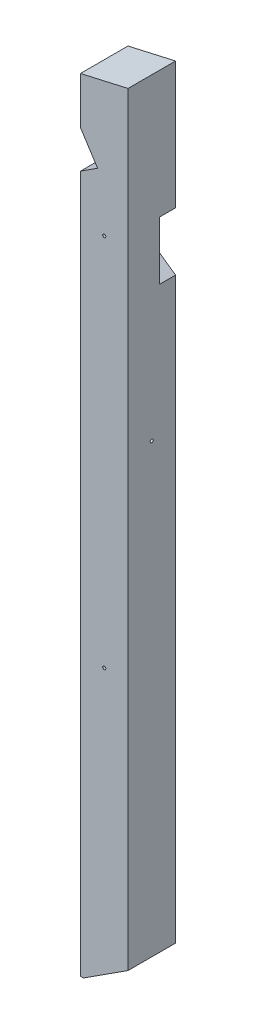
ISO-10303-21;
HEADER;
FILE_DESCRIPTION(('STEP AP214'),'2;1');
FILE_NAME('part.step','',(''),(''),'','','');
FILE_SCHEMA(('AUTOMOTIVE_DESIGN { 1 0 10303 214 1 1 1 1 }'));
ENDSEC;
DATA;
#1=APPLICATION_CONTEXT('core data for automotive mechanical design processes');
#2=APPLICATION_PROTOCOL_DEFINITION('international standard','automotive_design',2000,#1);
#3=PRODUCT_CONTEXT('',#1,'mechanical');
#4=PRODUCT('Part','Part','',(#3));
#5=PRODUCT_RELATED_PRODUCT_CATEGORY('part','',(#4));
#6=PRODUCT_DEFINITION_FORMATION('','',#4);
#7=PRODUCT_DEFINITION_CONTEXT('part definition',#1,'design');
#8=PRODUCT_DEFINITION('design','',#6,#7);
#9=PRODUCT_DEFINITION_SHAPE('','',#8);
#10=(LENGTH_UNIT() NAMED_UNIT(*) SI_UNIT(.MILLI.,.METRE.));
#11=(NAMED_UNIT(*) PLANE_ANGLE_UNIT() SI_UNIT($,.RADIAN.));
#12=(NAMED_UNIT(*) SI_UNIT($,.STERADIAN.) SOLID_ANGLE_UNIT());
#13=UNCERTAINTY_MEASURE_WITH_UNIT(LENGTH_MEASURE(1.E-05),#10,'distance_accuracy_value','');
#14=(GEOMETRIC_REPRESENTATION_CONTEXT(3) GLOBAL_UNCERTAINTY_ASSIGNED_CONTEXT((#13)) GLOBAL_UNIT_ASSIGNED_CONTEXT((#10,
#11,#12)) REPRESENTATION_CONTEXT('',''));
#15=CARTESIAN_POINT('',(0.,0.,0.));
#16=DIRECTION('',(0.,0.,1.));
#17=DIRECTION('',(1.,0.,0.));
#18=AXIS2_PLACEMENT_3D('',#15,#16,#17);
#19=CARTESIAN_POINT('',(-75.,1250.,-75.));
#20=DIRECTION('',(0.,0.,1.));
#21=DIRECTION('',(1.,0.,0.));
#22=AXIS2_PLACEMENT_3D('',#19,#20,#21);
#23=PLANE('',#22);
#24=DIRECTION('',(0.,-1.,0.));
#25=VECTOR('',#24,1.);
#26=CARTESIAN_POINT('',(75.,1250.,-75.));
#27=LINE('',#26,#25);
#28=CARTESIAN_POINT('',(75.,1250.,-75.));
#29=VERTEX_POINT('',#28);
#30=CARTESIAN_POINT('',(75.,848.874160527311,-75.));
#31=VERTEX_POINT('',#30);
#32=EDGE_CURVE('E224',#29,#31,#27,.T.);
#33=ORIENTED_EDGE('',*,*,#32,.T.);
#34=DIRECTION('',(0.81711888506879,-0.576469190559164,0.));
#35=VECTOR('',#34,1.);
#36=CARTESIAN_POINT('',(-75.0000000000008,954.697658385393,-75.));
#37=LINE('',#36,#35);
#38=CARTESIAN_POINT('',(-70.9333689934702,951.828690934665,-75.));
#39=VERTEX_POINT('',#38);
#40=EDGE_CURVE('E141',#39,#31,#37,.T.);
#41=ORIENTED_EDGE('',*,*,#40,.F.);
#42=DIRECTION('',(0.840689622138082,0.541517275097784,0.));
#43=VECTOR('',#42,1.);
#44=CARTESIAN_POINT('',(-20.8482724902223,984.090234633123,-75.));
#45=LINE('',#44,#43);
#46=CARTESIAN_POINT('',(-20.8482724902223,984.090234633123,-75.));
#47=VERTEX_POINT('',#46);
#48=EDGE_CURVE('E178',#39,#47,#45,.T.);
#49=ORIENTED_EDGE('',*,*,#48,.T.);
#50=DIRECTION('',(-0.541517275097784,0.840689622138082,0.));
#51=VECTOR('',#50,1.);
#52=CARTESIAN_POINT('',(-75.,1068.15919684693,-75.));
#53=LINE('',#52,#51);
#54=CARTESIAN_POINT('',(-75.,1068.15919684693,-75.));
#55=VERTEX_POINT('',#54);
#56=EDGE_CURVE('E180',#47,#55,#53,.T.);
#57=ORIENTED_EDGE('',*,*,#56,.T.);
#58=DIRECTION('',(0.,-1.,0.));
#59=VECTOR('',#58,1.);
#60=CARTESIAN_POINT('',(-75.,1250.,-75.));
#61=LINE('',#60,#59);
#62=CARTESIAN_POINT('',(-75.,1215.95666298101,-75.));
#63=VERTEX_POINT('',#62);
#64=EDGE_CURVE('E222',#63,#55,#61,.T.);
#65=ORIENTED_EDGE('',*,*,#64,.F.);
#66=DIRECTION('',(0.97519965033672,0.221327002381408,0.));
#67=VECTOR('',#66,1.);
#68=CARTESIAN_POINT('',(75.,1250.,-75.));
#69=LINE('',#68,#67);
#70=EDGE_CURVE('E171',#63,#29,#69,.T.);
#71=ORIENTED_EDGE('',*,*,#70,.T.);
#72=EDGE_LOOP('',(#33,#41,#49,#57,#65,#71));
#73=FACE_BOUND('',#72,.T.);
#74=ADVANCED_FACE('F37',(#73),#23,.F.);
#75=CARTESIAN_POINT('',(0.,810.,-75.));
#76=DIRECTION('',(0.,0.,1.));
#77=DIRECTION('',(1.,0.,0.));
#78=AXIS2_PLACEMENT_3D('',#75,#76,#77);
#79=CYLINDRICAL_SURFACE('',#78,5.00000000000001);
#80=CARTESIAN_POINT('',(0.,810.,75.));
#81=DIRECTION('',(0.,0.,1.));
#82=DIRECTION('',(1.,0.,0.));
#83=AXIS2_PLACEMENT_3D('',#80,#81,#82);
#84=CIRCLE('',#83,5.00000000000001);
#85=CARTESIAN_POINT('',(5.00000000000001,810.,75.));
#86=VERTEX_POINT('',#85);
#87=EDGE_CURVE('E196',#86,#86,#84,.T.);
#88=ORIENTED_EDGE('',*,*,#87,.T.);
#89=EDGE_LOOP('',(#88));
#90=FACE_BOUND('',#89,.T.);
#91=CARTESIAN_POINT('',(0.,810.,-25.));
#92=DIRECTION('',(0.,0.,-1.));
#93=DIRECTION('',(-1.,0.,0.));
#94=AXIS2_PLACEMENT_3D('',#91,#92,#93);
#95=CIRCLE('',#94,5.00000000000001);
#96=CARTESIAN_POINT('',(-5.00000000000001,810.,-25.));
#97=VERTEX_POINT('',#96);
#98=EDGE_CURVE('E153',#97,#97,#95,.F.);
#99=ORIENTED_EDGE('',*,*,#98,.F.);
#100=EDGE_LOOP('',(#99));
#101=FACE_BOUND('',#100,.T.);
#102=ADVANCED_FACE('F283',(#90,#101),#79,.F.);
#103=CARTESIAN_POINT('',(-75.,1250.,-75.));
#104=DIRECTION('',(1.,0.,0.));
#105=DIRECTION('',(0.,0.,-1.));
#106=AXIS2_PLACEMENT_3D('',#103,#104,#105);
#107=PLANE('',#106);
#108=DIRECTION('',(0.,-1.,0.));
#109=VECTOR('',#108,1.);
#110=CARTESIAN_POINT('',(-75.,1250.,75.));
#111=LINE('',#110,#109);
#112=CARTESIAN_POINT('',(-75.,1215.95666298101,75.));
#113=VERTEX_POINT('',#112);
#114=CARTESIAN_POINT('',(-75.,1068.15919684693,75.));
#115=VERTEX_POINT('',#114);
#116=EDGE_CURVE('E219',#113,#115,#111,.T.);
#117=ORIENTED_EDGE('',*,*,#116,.F.);
#118=DIRECTION('',(0.,0.,1.));
#119=VECTOR('',#118,1.);
#120=CARTESIAN_POINT('',(-75.,1215.95666298101,-75.));
#121=LINE('',#120,#119);
#122=EDGE_CURVE('E174',#63,#113,#121,.T.);
#123=ORIENTED_EDGE('',*,*,#122,.F.);
#124=ORIENTED_EDGE('',*,*,#64,.T.);
#125=DIRECTION('',(0.,0.,1.));
#126=VECTOR('',#125,1.);
#127=CARTESIAN_POINT('',(-75.,1068.15919684693,-75.));
#128=LINE('',#127,#126);
#129=EDGE_CURVE('E189',#55,#115,#128,.T.);
#130=ORIENTED_EDGE('',*,*,#129,.T.);
#131=EDGE_LOOP('',(#117,#123,#124,#130));
#132=FACE_BOUND('',#131,.T.);
#133=ADVANCED_FACE('F265',(#132),#107,.F.);
#134=CARTESIAN_POINT('',(75.,1250.,-75.));
#135=DIRECTION('',(-1.,0.,0.));
#136=DIRECTION('',(0.,0.,1.));
#137=AXIS2_PLACEMENT_3D('',#134,#135,#136);
#138=PLANE('',#137);
#139=CARTESIAN_POINT('',(75.,250.,0.));
#140=DIRECTION('',(-1.,0.,0.));
#141=DIRECTION('',(0.,0.,1.));
#142=AXIS2_PLACEMENT_3D('',#139,#140,#141);
#143=CIRCLE('',#142,5.00000000000001);
#144=CARTESIAN_POINT('',(75.,250.,5.));
#145=VERTEX_POINT('',#144);
#146=EDGE_CURVE('E157',#145,#145,#143,.T.);
#147=ORIENTED_EDGE('',*,*,#146,.T.);
#148=EDGE_LOOP('',(#147));
#149=FACE_BOUND('',#148,.T.);
#150=DIRECTION('',(0.,-1.,0.));
#151=VECTOR('',#150,1.);
#152=CARTESIAN_POINT('',(75.,848.874160527311,-25.));
#153=LINE('',#152,#151);
#154=CARTESIAN_POINT('',(75.,848.874160527311,-25.));
#155=VERTEX_POINT('',#154);
#156=CARTESIAN_POINT('',(75.,665.302341614606,-25.));
#157=VERTEX_POINT('',#156);
#158=EDGE_CURVE('E132',#155,#157,#153,.T.);
#159=ORIENTED_EDGE('',*,*,#158,.F.);
#160=DIRECTION('',(0.,0.,-1.));
#161=VECTOR('',#160,1.);
#162=CARTESIAN_POINT('',(75.,848.874160527311,-25.));
#163=LINE('',#162,#161);
#164=EDGE_CURVE('E146',#155,#31,#163,.T.);
#165=ORIENTED_EDGE('',*,*,#164,.T.);
#166=ORIENTED_EDGE('',*,*,#32,.F.);
#167=DIRECTION('',(0.,0.,-1.));
#168=VECTOR('',#167,1.);
#169=CARTESIAN_POINT('',(75.,1250.,-75.));
#170=LINE('',#169,#168);
#171=CARTESIAN_POINT('',(75.,1250.,75.));
#172=VERTEX_POINT('',#171);
#173=EDGE_CURVE('E205',#172,#29,#170,.T.);
#174=ORIENTED_EDGE('',*,*,#173,.F.);
#175=DIRECTION('',(0.,-1.,0.));
#176=VECTOR('',#175,1.);
#177=CARTESIAN_POINT('',(75.,1250.,75.));
#178=LINE('',#177,#176);
#179=CARTESIAN_POINT('',(75.,-1159.47022319023,75.));
#180=VERTEX_POINT('',#179);
#181=EDGE_CURVE('E207',#172,#180,#178,.T.);
#182=ORIENTED_EDGE('',*,*,#181,.T.);
#183=DIRECTION('',(0.,0.,1.));
#184=VECTOR('',#183,1.);
#185=CARTESIAN_POINT('',(75.,-1159.47022319023,-75.));
#186=LINE('',#185,#184);
#187=CARTESIAN_POINT('',(75.,-1159.47022319023,-75.));
#188=VERTEX_POINT('',#187);
#189=EDGE_CURVE('E165',#188,#180,#186,.T.);
#190=ORIENTED_EDGE('',*,*,#189,.F.);
#191=CARTESIAN_POINT('',(75.,665.302341614606,-75.));
#192=VERTEX_POINT('',#191);
#193=EDGE_CURVE('E145',#192,#188,#27,.T.);
#194=ORIENTED_EDGE('',*,*,#193,.F.);
#195=DIRECTION('',(0.,0.,-1.));
#196=VECTOR('',#195,1.);
#197=CARTESIAN_POINT('',(75.,665.302341614606,-25.));
#198=LINE('',#197,#196);
#199=EDGE_CURVE('E129',#157,#192,#198,.T.);
#200=ORIENTED_EDGE('',*,*,#199,.F.);
#201=EDGE_LOOP('',(#159,#165,#166,#174,#182,#190,#194,#200));
#202=FACE_BOUND('',#201,.T.);
#203=ADVANCED_FACE('F39',(#149,#202),#138,.F.);
#204=CARTESIAN_POINT('',(0.,-370.,-75.));
#205=DIRECTION('',(0.,0.,1.));
#206=DIRECTION('',(1.,0.,0.));
#207=AXIS2_PLACEMENT_3D('',#204,#205,#206);
#208=CIRCLE('',#207,5.00000000000001);
#209=CARTESIAN_POINT('',(5.00000000000001,-370.,-75.));
#210=VERTEX_POINT('',#209);
#211=EDGE_CURVE('E192',#210,#210,#208,.T.);
#212=ORIENTED_EDGE('',*,*,#211,.T.);
#213=EDGE_LOOP('',(#212));
#214=FACE_BOUND('',#213,.T.);
#215=CARTESIAN_POINT('',(-75.,771.125839472687,-75.));
#216=VERTEX_POINT('',#215);
#217=CARTESIAN_POINT('',(-75.,-1250.,-75.));
#218=VERTEX_POINT('',#217);
#219=EDGE_CURVE('E221',#216,#218,#61,.T.);
#220=ORIENTED_EDGE('',*,*,#219,.F.);
#221=DIRECTION('',(-0.81711888506879,0.576469190559164,0.));
#222=VECTOR('',#221,1.);
#223=CARTESIAN_POINT('',(75.,665.302341614606,-75.));
#224=LINE('',#223,#222);
#225=EDGE_CURVE('E239',#192,#216,#224,.T.);
#226=ORIENTED_EDGE('',*,*,#225,.F.);
#227=ORIENTED_EDGE('',*,*,#193,.T.);
#228=DIRECTION('',(-0.840689622138083,-0.541517275097783,0.));
#229=VECTOR('',#228,1.);
#230=CARTESIAN_POINT('',(75.,-1159.47022319023,-75.));
#231=LINE('',#230,#229);
#232=CARTESIAN_POINT('',(-65.5448124341153,-1250.,-75.));
#233=VERTEX_POINT('',#232);
#234=EDGE_CURVE('E162',#188,#233,#231,.T.);
#235=ORIENTED_EDGE('',*,*,#234,.T.);
#236=DIRECTION('',(-1.,0.,0.));
#237=VECTOR('',#236,1.);
#238=CARTESIAN_POINT('',(-75.,-1250.,-75.));
#239=LINE('',#238,#237);
#240=EDGE_CURVE('E199',#233,#218,#239,.T.);
#241=ORIENTED_EDGE('',*,*,#240,.T.);
#242=EDGE_LOOP('',(#220,#226,#227,#235,#241));
#243=FACE_BOUND('',#242,.T.);
#244=ADVANCED_FACE('F245',(#214,#243),#23,.F.);
#245=CARTESIAN_POINT('',(-75.,250.,0.));
#246=DIRECTION('',(-1.,0.,0.));
#247=DIRECTION('',(0.,0.,1.));
#248=AXIS2_PLACEMENT_3D('',#245,#246,#247);
#249=CIRCLE('',#248,5.00000000000001);
#250=CARTESIAN_POINT('',(-75.,250.,5.00000000000002));
#251=VERTEX_POINT('',#250);
#252=EDGE_CURVE('E156',#251,#251,#249,.T.);
#253=ORIENTED_EDGE('',*,*,#252,.F.);
#254=EDGE_LOOP('',(#253));
#255=FACE_BOUND('',#254,.T.);
#256=DIRECTION('',(0.,1.,0.));
#257=VECTOR('',#256,1.);
#258=CARTESIAN_POINT('',(-75.,1250.,-25.));
#259=LINE('',#258,#257);
#260=CARTESIAN_POINT('',(-75.,771.125839472687,-25.));
#261=VERTEX_POINT('',#260);
#262=CARTESIAN_POINT('',(-75.,949.209233190101,-25.));
#263=VERTEX_POINT('',#262);
#264=EDGE_CURVE('E52',#261,#263,#259,.T.);
#265=ORIENTED_EDGE('',*,*,#264,.F.);
#266=DIRECTION('',(0.,0.,-1.));
#267=VECTOR('',#266,1.);
#268=CARTESIAN_POINT('',(-75.,771.125839472687,-75.));
#269=LINE('',#268,#267);
#270=EDGE_CURVE('E11',#261,#216,#269,.T.);
#271=ORIENTED_EDGE('',*,*,#270,.T.);
#272=ORIENTED_EDGE('',*,*,#219,.T.);
#273=DIRECTION('',(0.,0.,1.));
#274=VECTOR('',#273,1.);
#275=CARTESIAN_POINT('',(-75.,-1250.,-75.));
#276=LINE('',#275,#274);
#277=CARTESIAN_POINT('',(-75.,-1250.,75.));
#278=VERTEX_POINT('',#277);
#279=EDGE_CURVE('E211',#218,#278,#276,.T.);
#280=ORIENTED_EDGE('',*,*,#279,.T.);
#281=CARTESIAN_POINT('',(-75.,949.209233190101,75.));
#282=VERTEX_POINT('',#281);
#283=EDGE_CURVE('E218',#282,#278,#111,.T.);
#284=ORIENTED_EDGE('',*,*,#283,.F.);
#285=DIRECTION('',(0.,0.,1.));
#286=VECTOR('',#285,1.);
#287=CARTESIAN_POINT('',(-75.,949.209233190101,-75.));
#288=LINE('',#287,#286);
#289=EDGE_CURVE('E184',#263,#282,#288,.T.);
#290=ORIENTED_EDGE('',*,*,#289,.F.);
#291=EDGE_LOOP('',(#265,#271,#272,#280,#284,#290));
#292=FACE_BOUND('',#291,.T.);
#293=ADVANCED_FACE('F244',(#255,#292),#107,.F.);
#294=CARTESIAN_POINT('',(-75.,1250.,75.));
#295=DIRECTION('',(0.,0.,-1.));
#296=DIRECTION('',(-1.,0.,0.));
#297=AXIS2_PLACEMENT_3D('',#294,#295,#296);
#298=PLANE('',#297);
#299=ORIENTED_EDGE('',*,*,#87,.F.);
#300=EDGE_LOOP('',(#299));
#301=FACE_BOUND('',#300,.T.);
#302=CARTESIAN_POINT('',(0.,-370.,75.));
#303=DIRECTION('',(0.,0.,1.));
#304=DIRECTION('',(1.,0.,0.));
#305=AXIS2_PLACEMENT_3D('',#302,#303,#304);
#306=CIRCLE('',#305,5.00000000000001);
#307=CARTESIAN_POINT('',(5.00000000000001,-370.,75.));
#308=VERTEX_POINT('',#307);
#309=EDGE_CURVE('E200',#308,#308,#306,.T.);
#310=ORIENTED_EDGE('',*,*,#309,.F.);
#311=EDGE_LOOP('',(#310));
#312=FACE_BOUND('',#311,.T.);
#313=DIRECTION('',(1.,0.,0.));
#314=VECTOR('',#313,1.);
#315=CARTESIAN_POINT('',(-75.,-1250.,75.));
#316=LINE('',#315,#314);
#317=CARTESIAN_POINT('',(-65.5448124341153,-1250.,75.));
#318=VERTEX_POINT('',#317);
#319=EDGE_CURVE('E208',#278,#318,#316,.T.);
#320=ORIENTED_EDGE('',*,*,#319,.T.);
#321=DIRECTION('',(-0.840689622138083,-0.541517275097783,0.));
#322=VECTOR('',#321,1.);
#323=CARTESIAN_POINT('',(75.,-1159.47022319023,75.));
#324=LINE('',#323,#322);
#325=EDGE_CURVE('E60',#180,#318,#324,.T.);
#326=ORIENTED_EDGE('',*,*,#325,.F.);
#327=ORIENTED_EDGE('',*,*,#181,.F.);
#328=DIRECTION('',(0.97519965033672,0.221327002381408,0.));
#329=VECTOR('',#328,1.);
#330=CARTESIAN_POINT('',(75.,1250.,75.));
#331=LINE('',#330,#329);
#332=EDGE_CURVE('E169',#113,#172,#331,.T.);
#333=ORIENTED_EDGE('',*,*,#332,.F.);
#334=ORIENTED_EDGE('',*,*,#116,.T.);
#335=DIRECTION('',(-0.541517275097784,0.840689622138082,0.));
#336=VECTOR('',#335,1.);
#337=CARTESIAN_POINT('',(-75.,1068.15919684693,75.));
#338=LINE('',#337,#336);
#339=CARTESIAN_POINT('',(-20.8482724902223,984.090234633123,75.));
#340=VERTEX_POINT('',#339);
#341=EDGE_CURVE('E181',#340,#115,#338,.T.);
#342=ORIENTED_EDGE('',*,*,#341,.F.);
#343=DIRECTION('',(0.840689622138082,0.541517275097784,0.));
#344=VECTOR('',#343,1.);
#345=CARTESIAN_POINT('',(-20.8482724902223,984.090234633123,75.));
#346=LINE('',#345,#344);
#347=EDGE_CURVE('E177',#282,#340,#346,.T.);
#348=ORIENTED_EDGE('',*,*,#347,.F.);
#349=ORIENTED_EDGE('',*,*,#283,.T.);
#350=EDGE_LOOP('',(#320,#326,#327,#333,#334,#342,#348,#349));
#351=FACE_BOUND('',#350,.T.);
#352=ADVANCED_FACE('F255',(#301,#312,#351),#298,.F.);
#353=CARTESIAN_POINT('',(0.,-1250.,0.));
#354=DIRECTION('',(0.,1.,0.));
#355=DIRECTION('',(0.,0.,1.));
#356=AXIS2_PLACEMENT_3D('',#353,#354,#355);
#357=PLANE('',#356);
#358=ORIENTED_EDGE('',*,*,#240,.F.);
#359=DIRECTION('',(0.,0.,1.));
#360=VECTOR('',#359,1.);
#361=CARTESIAN_POINT('',(-65.5448124341153,-1250.,-75.));
#362=LINE('',#361,#360);
#363=EDGE_CURVE('E167',#233,#318,#362,.T.);
#364=ORIENTED_EDGE('',*,*,#363,.T.);
#365=ORIENTED_EDGE('',*,*,#319,.F.);
#366=ORIENTED_EDGE('',*,*,#279,.F.);
#367=EDGE_LOOP('',(#358,#364,#365,#366));
#368=FACE_BOUND('',#367,.T.);
#369=ADVANCED_FACE('F251',(#368),#357,.F.);
#370=CARTESIAN_POINT('',(0.,-370.,-75.));
#371=DIRECTION('',(0.,0.,1.));
#372=DIRECTION('',(1.,0.,0.));
#373=AXIS2_PLACEMENT_3D('',#370,#371,#372);
#374=CYLINDRICAL_SURFACE('',#373,5.00000000000001);
#375=ORIENTED_EDGE('',*,*,#211,.F.);
#376=EDGE_LOOP('',(#375));
#377=FACE_BOUND('',#376,.T.);
#378=ORIENTED_EDGE('',*,*,#309,.T.);
#379=EDGE_LOOP('',(#378));
#380=FACE_BOUND('',#379,.T.);
#381=ADVANCED_FACE('F301',(#377,#380),#374,.F.);
#382=CARTESIAN_POINT('',(-75.,1068.15919684693,-75.));
#383=DIRECTION('',(0.840689622138082,0.541517275097784,0.));
#384=DIRECTION('',(-0.541517275097784,0.840689622138082,0.));
#385=AXIS2_PLACEMENT_3D('',#382,#383,#384);
#386=PLANE('',#385);
#387=ORIENTED_EDGE('',*,*,#341,.T.);
#388=ORIENTED_EDGE('',*,*,#129,.F.);
#389=ORIENTED_EDGE('',*,*,#56,.F.);
#390=DIRECTION('',(0.,0.,1.));
#391=VECTOR('',#390,1.);
#392=CARTESIAN_POINT('',(-20.8482724902223,984.090234633123,-75.));
#393=LINE('',#392,#391);
#394=EDGE_CURVE('E193',#47,#340,#393,.T.);
#395=ORIENTED_EDGE('',*,*,#394,.T.);
#396=EDGE_LOOP('',(#387,#388,#389,#395));
#397=FACE_BOUND('',#396,.T.);
#398=ADVANCED_FACE('F260',(#397),#386,.F.);
#399=CARTESIAN_POINT('',(-20.8482724902223,984.090234633123,-75.));
#400=DIRECTION('',(0.541517275097784,-0.840689622138082,0.));
#401=DIRECTION('',(0.840689622138082,0.541517275097784,0.));
#402=AXIS2_PLACEMENT_3D('',#399,#400,#401);
#403=PLANE('',#402);
#404=ORIENTED_EDGE('',*,*,#48,.F.);
#405=DIRECTION('',(0.,0.,1.));
#406=VECTOR('',#405,1.);
#407=CARTESIAN_POINT('',(-70.9333689934701,951.828690934665,-75.));
#408=LINE('',#407,#406);
#409=CARTESIAN_POINT('',(-70.9333689934702,951.828690934665,-25.));
#410=VERTEX_POINT('',#409);
#411=EDGE_CURVE('E45',#39,#410,#408,.T.);
#412=ORIENTED_EDGE('',*,*,#411,.T.);
#413=DIRECTION('',(0.840689622138082,0.541517275097784,0.));
#414=VECTOR('',#413,1.);
#415=CARTESIAN_POINT('',(-20.8482724902223,984.090234633123,-25.));
#416=LINE('',#415,#414);
#417=EDGE_CURVE('E227',#263,#410,#416,.T.);
#418=ORIENTED_EDGE('',*,*,#417,.F.);
#419=ORIENTED_EDGE('',*,*,#289,.T.);
#420=ORIENTED_EDGE('',*,*,#347,.T.);
#421=ORIENTED_EDGE('',*,*,#394,.F.);
#422=EDGE_LOOP('',(#404,#412,#418,#419,#420,#421));
#423=FACE_BOUND('',#422,.T.);
#424=ADVANCED_FACE('F231',(#423),#403,.F.);
#425=CARTESIAN_POINT('',(75.,1250.,-75.));
#426=DIRECTION('',(0.221327002381408,-0.97519965033672,0.));
#427=DIRECTION('',(0.97519965033672,0.221327002381408,0.));
#428=AXIS2_PLACEMENT_3D('',#425,#426,#427);
#429=PLANE('',#428);
#430=ORIENTED_EDGE('',*,*,#332,.T.);
#431=ORIENTED_EDGE('',*,*,#173,.T.);
#432=ORIENTED_EDGE('',*,*,#70,.F.);
#433=ORIENTED_EDGE('',*,*,#122,.T.);
#434=EDGE_LOOP('',(#430,#431,#432,#433));
#435=FACE_BOUND('',#434,.T.);
#436=ADVANCED_FACE('F268',(#435),#429,.F.);
#437=CARTESIAN_POINT('',(75.,-1159.47022319023,-75.));
#438=DIRECTION('',(-0.541517275097783,0.840689622138083,0.));
#439=DIRECTION('',(-0.840689622138083,-0.541517275097783,0.));
#440=AXIS2_PLACEMENT_3D('',#437,#438,#439);
#441=PLANE('',#440);
#442=ORIENTED_EDGE('',*,*,#325,.T.);
#443=ORIENTED_EDGE('',*,*,#363,.F.);
#444=ORIENTED_EDGE('',*,*,#234,.F.);
#445=ORIENTED_EDGE('',*,*,#189,.T.);
#446=EDGE_LOOP('',(#442,#443,#444,#445));
#447=FACE_BOUND('',#446,.T.);
#448=ADVANCED_FACE('F271',(#447),#441,.F.);
#449=CARTESIAN_POINT('',(75.,250.,0.));
#450=DIRECTION('',(-1.,0.,0.));
#451=DIRECTION('',(0.,0.,1.));
#452=AXIS2_PLACEMENT_3D('',#449,#450,#451);
#453=CYLINDRICAL_SURFACE('',#452,5.00000000000001);
#454=ORIENTED_EDGE('',*,*,#146,.F.);
#455=EDGE_LOOP('',(#454));
#456=FACE_BOUND('',#455,.T.);
#457=ORIENTED_EDGE('',*,*,#252,.T.);
#458=EDGE_LOOP('',(#457));
#459=FACE_BOUND('',#458,.T.);
#460=ADVANCED_FACE('F273',(#456,#459),#453,.F.);
#461=CARTESIAN_POINT('',(75.,665.302341614606,-25.));
#462=DIRECTION('',(-0.576469190559164,-0.81711888506879,0.));
#463=DIRECTION('',(0.81711888506879,-0.576469190559164,0.));
#464=AXIS2_PLACEMENT_3D('',#461,#462,#463);
#465=PLANE('',#464);
#466=DIRECTION('',(-0.81711888506879,0.576469190559164,0.));
#467=VECTOR('',#466,1.);
#468=CARTESIAN_POINT('',(75.,665.302341614606,-25.));
#469=LINE('',#468,#467);
#470=EDGE_CURVE('E125',#157,#261,#469,.T.);
#471=ORIENTED_EDGE('',*,*,#470,.F.);
#472=ORIENTED_EDGE('',*,*,#199,.T.);
#473=ORIENTED_EDGE('',*,*,#225,.T.);
#474=ORIENTED_EDGE('',*,*,#270,.F.);
#475=EDGE_LOOP('',(#471,#472,#473,#474));
#476=FACE_BOUND('',#475,.T.);
#477=ADVANCED_FACE('F127',(#476),#465,.F.);
#478=CARTESIAN_POINT('',(-75.0000000000008,954.697658385393,-25.));
#479=DIRECTION('',(0.576469190559164,0.81711888506879,0.));
#480=DIRECTION('',(-0.81711888506879,0.576469190559164,0.));
#481=AXIS2_PLACEMENT_3D('',#478,#479,#480);
#482=PLANE('',#481);
#483=ORIENTED_EDGE('',*,*,#40,.T.);
#484=ORIENTED_EDGE('',*,*,#164,.F.);
#485=DIRECTION('',(0.81711888506879,-0.576469190559164,0.));
#486=VECTOR('',#485,1.);
#487=CARTESIAN_POINT('',(-75.0000000000008,954.697658385393,-25.));
#488=LINE('',#487,#486);
#489=EDGE_CURVE('E131',#410,#155,#488,.T.);
#490=ORIENTED_EDGE('',*,*,#489,.F.);
#491=ORIENTED_EDGE('',*,*,#411,.F.);
#492=EDGE_LOOP('',(#483,#484,#490,#491));
#493=FACE_BOUND('',#492,.T.);
#494=ADVANCED_FACE('F236',(#493),#482,.F.);
#495=CARTESIAN_POINT('',(0.,0.,-25.));
#496=DIRECTION('',(0.,0.,-1.));
#497=DIRECTION('',(-1.,0.,0.));
#498=AXIS2_PLACEMENT_3D('',#495,#496,#497);
#499=PLANE('',#498);
#500=ORIENTED_EDGE('',*,*,#264,.T.);
#501=ORIENTED_EDGE('',*,*,#417,.T.);
#502=ORIENTED_EDGE('',*,*,#489,.T.);
#503=ORIENTED_EDGE('',*,*,#158,.T.);
#504=ORIENTED_EDGE('',*,*,#470,.T.);
#505=EDGE_LOOP('',(#500,#501,#502,#503,#504));
#506=FACE_BOUND('',#505,.T.);
#507=ORIENTED_EDGE('',*,*,#98,.T.);
#508=EDGE_LOOP('',(#507));
#509=FACE_BOUND('',#508,.T.);
#510=ADVANCED_FACE('F135',(#506,#509),#499,.T.);
#511=CLOSED_SHELL('',(#74,#102,#133,#203,#244,#293,#352,#369,#381,#398,#424,#436,#448,#460,#477,
#494,#510));
#512=MANIFOLD_SOLID_BREP('B2',#511);
#513=ADVANCED_BREP_SHAPE_REPRESENTATION('',(#18,#512),#14);
#514=SHAPE_DEFINITION_REPRESENTATION(#9,#513);
ENDSEC;
END-ISO-10303-21;
